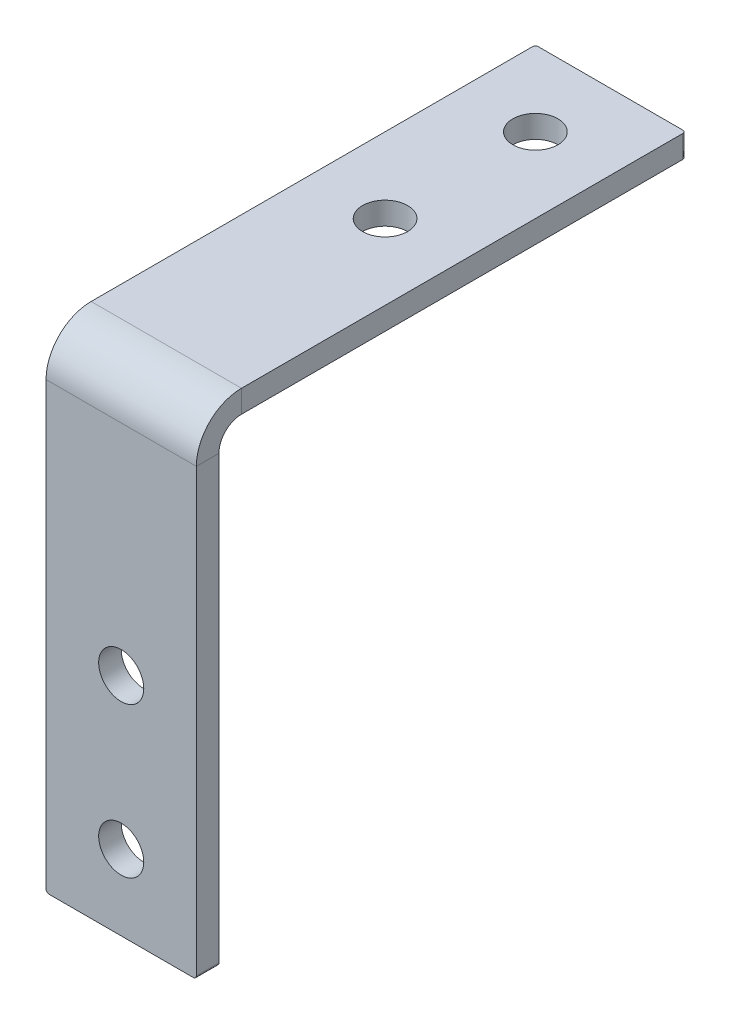
ISO-10303-21;
HEADER;
FILE_DESCRIPTION(('STEP AP214'),'2;1');
FILE_NAME('part.step','',(''),(''),'','','');
FILE_SCHEMA(('AUTOMOTIVE_DESIGN { 1 0 10303 214 1 1 1 1 }'));
ENDSEC;
DATA;
#1=APPLICATION_CONTEXT('core data for automotive mechanical design processes');
#2=APPLICATION_PROTOCOL_DEFINITION('international standard','automotive_design',2000,#1);
#3=PRODUCT_CONTEXT('',#1,'mechanical');
#4=PRODUCT('Part','Part','',(#3));
#5=PRODUCT_RELATED_PRODUCT_CATEGORY('part','',(#4));
#6=PRODUCT_DEFINITION_FORMATION('','',#4);
#7=PRODUCT_DEFINITION_CONTEXT('part definition',#1,'design');
#8=PRODUCT_DEFINITION('design','',#6,#7);
#9=PRODUCT_DEFINITION_SHAPE('','',#8);
#10=(LENGTH_UNIT() NAMED_UNIT(*) SI_UNIT(.MILLI.,.METRE.));
#11=(NAMED_UNIT(*) PLANE_ANGLE_UNIT() SI_UNIT($,.RADIAN.));
#12=(NAMED_UNIT(*) SI_UNIT($,.STERADIAN.) SOLID_ANGLE_UNIT());
#13=UNCERTAINTY_MEASURE_WITH_UNIT(LENGTH_MEASURE(1.E-05),#10,'distance_accuracy_value','');
#14=(GEOMETRIC_REPRESENTATION_CONTEXT(3) GLOBAL_UNCERTAINTY_ASSIGNED_CONTEXT((#13)) GLOBAL_UNIT_ASSIGNED_CONTEXT((#10,
#11,#12)) REPRESENTATION_CONTEXT('',''));
#15=CARTESIAN_POINT('',(0.,0.,0.));
#16=DIRECTION('',(0.,0.,1.));
#17=DIRECTION('',(1.,0.,0.));
#18=AXIS2_PLACEMENT_3D('',#15,#16,#17);
#19=CARTESIAN_POINT('',(10.,-1.69646003293849,3.375));
#20=DIRECTION('',(1.,0.,0.));
#21=DIRECTION('',(0.,1.,0.));
#22=AXIS2_PLACEMENT_3D('',#19,#20,#21);
#23=PLANE('',#22);
#24=CARTESIAN_POINT('',(10.,-1.69646003293849,-2.25));
#25=DIRECTION('',(1.,0.,0.));
#26=DIRECTION('',(0.,0.,1.));
#27=AXIS2_PLACEMENT_3D('',#24,#25,#26);
#28=CIRCLE('',#27,3.);
#29=CARTESIAN_POINT('',(10.,1.30353996706151,-2.25));
#30=VERTEX_POINT('',#29);
#31=CARTESIAN_POINT('',(10.,-1.69646003293849,0.75));
#32=VERTEX_POINT('',#31);
#33=EDGE_CURVE('E54',#30,#32,#28,.T.);
#34=ORIENTED_EDGE('',*,*,#33,.T.);
#35=DIRECTION('',(0.,0.,-1.));
#36=VECTOR('',#35,1.);
#37=CARTESIAN_POINT('',(10.,-1.69646003293849,0.75));
#38=LINE('',#37,#36);
#39=CARTESIAN_POINT('',(10.,-1.69646003293849,-0.75));
#40=VERTEX_POINT('',#39);
#41=EDGE_CURVE('E232',#32,#40,#38,.T.);
#42=ORIENTED_EDGE('',*,*,#41,.T.);
#43=CARTESIAN_POINT('',(10.,-1.69646003293849,-2.25));
#44=DIRECTION('',(-1.,0.,0.));
#45=DIRECTION('',(0.,0.,1.));
#46=AXIS2_PLACEMENT_3D('',#43,#44,#45);
#47=CIRCLE('',#46,1.5);
#48=CARTESIAN_POINT('',(10.,-0.196460032938488,-2.25));
#49=VERTEX_POINT('',#48);
#50=EDGE_CURVE('E273',#40,#49,#47,.T.);
#51=ORIENTED_EDGE('',*,*,#50,.T.);
#52=DIRECTION('',(0.,1.,0.));
#53=VECTOR('',#52,1.);
#54=CARTESIAN_POINT('',(10.,-0.196460032938488,-2.25));
#55=LINE('',#54,#53);
#56=EDGE_CURVE('E231',#49,#30,#55,.T.);
#57=ORIENTED_EDGE('',*,*,#56,.T.);
#58=EDGE_LOOP('',(#34,#42,#51,#57));
#59=FACE_BOUND('',#58,.T.);
#60=ADVANCED_FACE('F43',(#59),#23,.T.);
#61=CARTESIAN_POINT('',(0.,-1.69646003293849,3.375));
#62=DIRECTION('',(1.,0.,0.));
#63=DIRECTION('',(0.,1.,0.));
#64=AXIS2_PLACEMENT_3D('',#61,#62,#63);
#65=PLANE('',#64);
#66=CARTESIAN_POINT('',(0.,-1.69646003293849,-2.25));
#67=DIRECTION('',(-1.,0.,0.));
#68=DIRECTION('',(0.,0.,1.));
#69=AXIS2_PLACEMENT_3D('',#66,#67,#68);
#70=CIRCLE('',#69,3.);
#71=CARTESIAN_POINT('',(0.,-1.69646003293849,0.75));
#72=VERTEX_POINT('',#71);
#73=CARTESIAN_POINT('',(0.,1.30353996706151,-2.25));
#74=VERTEX_POINT('',#73);
#75=EDGE_CURVE('E11',#72,#74,#70,.T.);
#76=ORIENTED_EDGE('',*,*,#75,.T.);
#77=DIRECTION('',(0.,-1.,0.));
#78=VECTOR('',#77,1.);
#79=CARTESIAN_POINT('',(0.,1.30353996706151,-2.25));
#80=LINE('',#79,#78);
#81=CARTESIAN_POINT('',(0.,-0.196460032938488,-2.25));
#82=VERTEX_POINT('',#81);
#83=EDGE_CURVE('E221',#74,#82,#80,.T.);
#84=ORIENTED_EDGE('',*,*,#83,.T.);
#85=CARTESIAN_POINT('',(0.,-1.69646003293849,-2.25));
#86=DIRECTION('',(1.,0.,0.));
#87=DIRECTION('',(0.,0.,1.));
#88=AXIS2_PLACEMENT_3D('',#85,#86,#87);
#89=CIRCLE('',#88,1.5);
#90=CARTESIAN_POINT('',(0.,-1.69646003293849,-0.75));
#91=VERTEX_POINT('',#90);
#92=EDGE_CURVE('E277',#82,#91,#89,.T.);
#93=ORIENTED_EDGE('',*,*,#92,.T.);
#94=DIRECTION('',(0.,0.,1.));
#95=VECTOR('',#94,1.);
#96=CARTESIAN_POINT('',(0.,-1.69646003293849,-0.75));
#97=LINE('',#96,#95);
#98=EDGE_CURVE('E281',#91,#72,#97,.T.);
#99=ORIENTED_EDGE('',*,*,#98,.T.);
#100=EDGE_LOOP('',(#76,#84,#93,#99));
#101=FACE_BOUND('',#100,.T.);
#102=ADVANCED_FACE('F370',(#101),#65,.F.);
#103=CARTESIAN_POINT('',(5.,-1.69646003293849,-2.25));
#104=DIRECTION('',(1.,0.,0.));
#105=DIRECTION('',(0.,0.,1.));
#106=AXIS2_PLACEMENT_3D('',#103,#104,#105);
#107=CYLINDRICAL_SURFACE('',#106,3.);
#108=ORIENTED_EDGE('',*,*,#75,.F.);
#109=DIRECTION('',(1.,0.,0.));
#110=VECTOR('',#109,1.);
#111=CARTESIAN_POINT('',(0.,-1.69646003293849,0.75));
#112=LINE('',#111,#110);
#113=EDGE_CURVE('E247',#72,#32,#112,.T.);
#114=ORIENTED_EDGE('',*,*,#113,.T.);
#115=ORIENTED_EDGE('',*,*,#33,.F.);
#116=DIRECTION('',(-1.,0.,0.));
#117=VECTOR('',#116,1.);
#118=CARTESIAN_POINT('',(10.,1.30353996706151,-2.25));
#119=LINE('',#118,#117);
#120=EDGE_CURVE('E225',#30,#74,#119,.T.);
#121=ORIENTED_EDGE('',*,*,#120,.T.);
#122=EDGE_LOOP('',(#108,#114,#115,#121));
#123=FACE_BOUND('',#122,.T.);
#124=ADVANCED_FACE('F376',(#123),#107,.T.);
#125=CARTESIAN_POINT('',(5.,-1.69646003293849,-2.25));
#126=DIRECTION('',(1.,0.,0.));
#127=DIRECTION('',(0.,0.,1.));
#128=AXIS2_PLACEMENT_3D('',#125,#126,#127);
#129=CYLINDRICAL_SURFACE('',#128,1.5);
#130=ORIENTED_EDGE('',*,*,#92,.F.);
#131=DIRECTION('',(1.,0.,0.));
#132=VECTOR('',#131,1.);
#133=CARTESIAN_POINT('',(0.,-0.196460032938488,-2.25));
#134=LINE('',#133,#132);
#135=EDGE_CURVE('E311',#82,#49,#134,.T.);
#136=ORIENTED_EDGE('',*,*,#135,.T.);
#137=ORIENTED_EDGE('',*,*,#50,.F.);
#138=DIRECTION('',(-1.,0.,0.));
#139=VECTOR('',#138,1.);
#140=CARTESIAN_POINT('',(10.,-1.69646003293849,-0.75));
#141=LINE('',#140,#139);
#142=EDGE_CURVE('E278',#40,#91,#141,.T.);
#143=ORIENTED_EDGE('',*,*,#142,.T.);
#144=EDGE_LOOP('',(#130,#136,#137,#143));
#145=FACE_BOUND('',#144,.T.);
#146=ADVANCED_FACE('F544',(#145),#129,.F.);
#147=CARTESIAN_POINT('',(5.,15.3554568738932,-0.75));
#148=DIRECTION('',(0.,0.,-1.));
#149=DIRECTION('',(1.,0.,0.));
#150=AXIS2_PLACEMENT_3D('',#147,#148,#149);
#151=PLANE('',#150);
#152=ORIENTED_EDGE('',*,*,#142,.F.);
#153=DIRECTION('',(0.,1.,0.));
#154=VECTOR('',#153,1.);
#155=CARTESIAN_POINT('',(10.,-31.05,-0.75));
#156=LINE('',#155,#154);
#157=CARTESIAN_POINT('',(10.,-31.05,-0.75));
#158=VERTEX_POINT('',#157);
#159=EDGE_CURVE('E321',#158,#40,#156,.T.);
#160=ORIENTED_EDGE('',*,*,#159,.F.);
#161=CARTESIAN_POINT('',(9.8,-31.05,-0.75));
#162=DIRECTION('',(0.,0.,-1.));
#163=DIRECTION('',(0.707106781186551,-0.707106781186544,0.));
#164=AXIS2_PLACEMENT_3D('',#161,#162,#163);
#165=CIRCLE('',#164,0.2);
#166=CARTESIAN_POINT('',(9.8,-31.25,-0.75));
#167=VERTEX_POINT('',#166);
#168=EDGE_CURVE('E264',#158,#167,#165,.T.);
#169=ORIENTED_EDGE('',*,*,#168,.T.);
#170=DIRECTION('',(1.,0.,0.));
#171=VECTOR('',#170,1.);
#172=CARTESIAN_POINT('',(0.200000000000008,-31.25,-0.75));
#173=LINE('',#172,#171);
#174=CARTESIAN_POINT('',(0.200000000000009,-31.25,-0.75));
#175=VERTEX_POINT('',#174);
#176=EDGE_CURVE('E47',#175,#167,#173,.T.);
#177=ORIENTED_EDGE('',*,*,#176,.F.);
#178=CARTESIAN_POINT('',(0.20000000000001,-31.05,-0.75));
#179=DIRECTION('',(0.,0.,-1.));
#180=DIRECTION('',(-0.707106781186539,-0.707106781186556,0.));
#181=AXIS2_PLACEMENT_3D('',#178,#179,#180);
#182=CIRCLE('',#181,0.2);
#183=CARTESIAN_POINT('',(0.,-31.05,-0.75));
#184=VERTEX_POINT('',#183);
#185=EDGE_CURVE('E263',#175,#184,#182,.T.);
#186=ORIENTED_EDGE('',*,*,#185,.T.);
#187=DIRECTION('',(0.,1.,0.));
#188=VECTOR('',#187,1.);
#189=CARTESIAN_POINT('',(0.,-31.05,-0.75));
#190=LINE('',#189,#188);
#191=EDGE_CURVE('E268',#184,#91,#190,.T.);
#192=ORIENTED_EDGE('',*,*,#191,.T.);
#193=EDGE_LOOP('',(#152,#160,#169,#177,#186,#192));
#194=FACE_BOUND('',#193,.T.);
#195=CARTESIAN_POINT('',(5.,-26.25,-0.75));
#196=DIRECTION('',(0.,0.,1.));
#197=DIRECTION('',(-1.,0.,0.));
#198=AXIS2_PLACEMENT_3D('',#195,#196,#197);
#199=CIRCLE('',#198,1.5);
#200=CARTESIAN_POINT('',(6.5,-26.25,-0.75));
#201=VERTEX_POINT('',#200);
#202=EDGE_CURVE('E255',#201,#201,#199,.T.);
#203=ORIENTED_EDGE('',*,*,#202,.T.);
#204=EDGE_LOOP('',(#203));
#205=FACE_BOUND('',#204,.T.);
#206=CARTESIAN_POINT('',(5.,-16.25,-0.75));
#207=DIRECTION('',(0.,0.,1.));
#208=DIRECTION('',(-1.,0.,0.));
#209=AXIS2_PLACEMENT_3D('',#206,#207,#208);
#210=CIRCLE('',#209,1.5);
#211=CARTESIAN_POINT('',(6.5,-16.25,-0.75));
#212=VERTEX_POINT('',#211);
#213=EDGE_CURVE('E256',#212,#212,#210,.T.);
#214=ORIENTED_EDGE('',*,*,#213,.T.);
#215=EDGE_LOOP('',(#214));
#216=FACE_BOUND('',#215,.T.);
#217=ADVANCED_FACE('F347',(#194,#205,#216),#151,.T.);
#218=CARTESIAN_POINT('',(0.,0.,0.));
#219=DIRECTION('',(-1.,0.,0.));
#220=DIRECTION('',(0.,0.,-1.));
#221=AXIS2_PLACEMENT_3D('',#218,#219,#220);
#222=PLANE('',#221);
#223=ORIENTED_EDGE('',*,*,#98,.F.);
#224=ORIENTED_EDGE('',*,*,#191,.F.);
#225=DIRECTION('',(0.,0.,1.));
#226=VECTOR('',#225,1.);
#227=CARTESIAN_POINT('',(0.,-31.05,-0.75));
#228=LINE('',#227,#226);
#229=CARTESIAN_POINT('',(0.,-31.05,0.75));
#230=VERTEX_POINT('',#229);
#231=EDGE_CURVE('E292',#184,#230,#228,.T.);
#232=ORIENTED_EDGE('',*,*,#231,.T.);
#233=DIRECTION('',(0.,1.,0.));
#234=VECTOR('',#233,1.);
#235=CARTESIAN_POINT('',(0.,-31.05,0.75));
#236=LINE('',#235,#234);
#237=EDGE_CURVE('E236',#230,#72,#236,.T.);
#238=ORIENTED_EDGE('',*,*,#237,.T.);
#239=EDGE_LOOP('',(#223,#224,#232,#238));
#240=FACE_BOUND('',#239,.T.);
#241=ADVANCED_FACE('F408',(#240),#222,.T.);
#242=CARTESIAN_POINT('',(9.8,-31.05,0.));
#243=DIRECTION('',(0.,0.,-1.));
#244=DIRECTION('',(0.707106781186551,-0.707106781186544,0.));
#245=AXIS2_PLACEMENT_3D('',#242,#243,#244);
#246=CYLINDRICAL_SURFACE('',#245,0.2);
#247=ORIENTED_EDGE('',*,*,#168,.F.);
#248=DIRECTION('',(0.,0.,-1.));
#249=VECTOR('',#248,1.);
#250=CARTESIAN_POINT('',(10.,-31.05,0.75));
#251=LINE('',#250,#249);
#252=CARTESIAN_POINT('',(10.,-31.05,0.75));
#253=VERTEX_POINT('',#252);
#254=EDGE_CURVE('E259',#253,#158,#251,.T.);
#255=ORIENTED_EDGE('',*,*,#254,.F.);
#256=CARTESIAN_POINT('',(9.8,-31.05,0.75));
#257=DIRECTION('',(0.,0.,1.));
#258=DIRECTION('',(0.707106781186551,-0.707106781186544,0.));
#259=AXIS2_PLACEMENT_3D('',#256,#257,#258);
#260=CIRCLE('',#259,0.2);
#261=CARTESIAN_POINT('',(9.8,-31.25,0.75));
#262=VERTEX_POINT('',#261);
#263=EDGE_CURVE('E262',#262,#253,#260,.T.);
#264=ORIENTED_EDGE('',*,*,#263,.F.);
#265=DIRECTION('',(0.,0.,1.));
#266=VECTOR('',#265,1.);
#267=CARTESIAN_POINT('',(9.8,-31.25,-0.75));
#268=LINE('',#267,#266);
#269=EDGE_CURVE('E269',#167,#262,#268,.T.);
#270=ORIENTED_EDGE('',*,*,#269,.F.);
#271=EDGE_LOOP('',(#247,#255,#264,#270));
#272=FACE_BOUND('',#271,.T.);
#273=ADVANCED_FACE('F398',(#272),#246,.T.);
#274=CARTESIAN_POINT('',(9.8,-31.25,0.75));
#275=CARTESIAN_POINT('',(0.200000000000008,-31.25,0.75));
#276=CARTESIAN_POINT('',(9.8,-31.25,-0.75));
#277=CARTESIAN_POINT('',(0.200000000000008,-31.25,-0.75));
#278=(BOUNDED_SURFACE() B_SPLINE_SURFACE(1,1,((#274,#275),(#276,#277)),.UNSPECIFIED.,.F.,.F.,
.F.) B_SPLINE_SURFACE_WITH_KNOTS((2,2),(2,2),(0.,1.5),(0.,9.6),
.UNSPECIFIED.) GEOMETRIC_REPRESENTATION_ITEM() RATIONAL_B_SPLINE_SURFACE(((1.,1.),(1.,1.))) REPRESENTATION_ITEM('') SURFACE());
#279=DIRECTION('',(-1.,0.,0.));
#280=VECTOR('',#279,1.);
#281=CARTESIAN_POINT('',(9.8,-31.25,0.75));
#282=LINE('',#281,#280);
#283=CARTESIAN_POINT('',(0.200000000000009,-31.25,0.75));
#284=VERTEX_POINT('',#283);
#285=EDGE_CURVE('E243',#262,#284,#282,.T.);
#286=DIRECTION('',(0.,0.,-1.));
#287=VECTOR('',#286,1.);
#288=CARTESIAN_POINT('',(0.20000000000001,-31.25,0.75));
#289=LINE('',#288,#287);
#290=EDGE_CURVE('E304',#284,#175,#289,.T.);
#291=ORIENTED_EDGE('',*,*,#269,.T.);
#292=ORIENTED_EDGE('',*,*,#285,.T.);
#293=ORIENTED_EDGE('',*,*,#290,.T.);
#294=ORIENTED_EDGE('',*,*,#176,.T.);
#295=EDGE_LOOP('',(#291,#292,#293,#294));
#296=FACE_BOUND('',#295,.T.);
#297=ADVANCED_FACE('F389',(#296),#278,.F.);
#298=CARTESIAN_POINT('',(0.20000000000001,-31.05,0.));
#299=DIRECTION('',(0.,0.,-1.));
#300=DIRECTION('',(-0.707106781186539,-0.707106781186556,0.));
#301=AXIS2_PLACEMENT_3D('',#298,#299,#300);
#302=CYLINDRICAL_SURFACE('',#301,0.2);
#303=ORIENTED_EDGE('',*,*,#185,.F.);
#304=ORIENTED_EDGE('',*,*,#290,.F.);
#305=CARTESIAN_POINT('',(0.20000000000001,-31.05,0.75));
#306=DIRECTION('',(0.,0.,1.));
#307=DIRECTION('',(-0.707106781186539,-0.707106781186556,0.));
#308=AXIS2_PLACEMENT_3D('',#305,#306,#307);
#309=CIRCLE('',#308,0.2);
#310=EDGE_CURVE('E337',#230,#284,#309,.T.);
#311=ORIENTED_EDGE('',*,*,#310,.F.);
#312=ORIENTED_EDGE('',*,*,#231,.F.);
#313=EDGE_LOOP('',(#303,#304,#311,#312));
#314=FACE_BOUND('',#313,.T.);
#315=ADVANCED_FACE('F362',(#314),#302,.T.);
#316=CARTESIAN_POINT('',(6.5,-26.25,0.75));
#317=CARTESIAN_POINT('',(6.5,-27.75,0.75));
#318=CARTESIAN_POINT('',(5.,-27.75,0.75));
#319=CARTESIAN_POINT('',(3.49999999999999,-27.75,0.75));
#320=CARTESIAN_POINT('',(3.5,-26.25,0.75));
#321=CARTESIAN_POINT('',(3.49999999999999,-24.75,0.75));
#322=CARTESIAN_POINT('',(5.,-24.75,0.75));
#323=CARTESIAN_POINT('',(6.5,-24.75,0.75));
#324=CARTESIAN_POINT('',(6.5,-26.25,0.75));
#325=CARTESIAN_POINT('',(6.5,-26.25,-0.75));
#326=CARTESIAN_POINT('',(6.5,-27.75,-0.75));
#327=CARTESIAN_POINT('',(5.,-27.75,-0.75));
#328=CARTESIAN_POINT('',(3.49999999999999,-27.75,-0.75));
#329=CARTESIAN_POINT('',(3.5,-26.25,-0.75));
#330=CARTESIAN_POINT('',(3.49999999999999,-24.75,-0.75));
#331=CARTESIAN_POINT('',(5.,-24.75,-0.75));
#332=CARTESIAN_POINT('',(6.5,-24.75,-0.75));
#333=CARTESIAN_POINT('',(6.5,-26.25,-0.75));
#334=(BOUNDED_SURFACE() B_SPLINE_SURFACE(1,2,((#316,#317,#318,#319,#320,#321,#322,#323,#324),
(#325,#326,#327,#328,#329,#330,#331,#332,#333)),.UNSPECIFIED.,.F.,.T.,
.F.) B_SPLINE_SURFACE_WITH_KNOTS((2,2),(3,2,2,2,3),(-0.5,0.5),(0.,2.35619449019234,
4.71238898038469,7.06858347057704,9.42477796076938),
.UNSPECIFIED.) GEOMETRIC_REPRESENTATION_ITEM() RATIONAL_B_SPLINE_SURFACE(((1.,0.707106781186548,
1.,0.707106781186548,1.,0.707106781186548,1.,0.707106781186548,1.),(1.,0.707106781186548,1.,
0.707106781186548,1.,0.707106781186548,1.,0.707106781186548,1.))) REPRESENTATION_ITEM('') SURFACE());
#335=CARTESIAN_POINT('',(5.,-26.25,0.75));
#336=DIRECTION('',(0.,0.,-1.));
#337=DIRECTION('',(-1.,0.,0.));
#338=AXIS2_PLACEMENT_3D('',#335,#336,#337);
#339=CIRCLE('',#338,1.5);
#340=CARTESIAN_POINT('',(6.5,-26.25,0.75));
#341=VERTEX_POINT('',#340);
#342=EDGE_CURVE('E301',#341,#341,#339,.T.);
#343=ORIENTED_EDGE('',*,*,#342,.F.);
#344=EDGE_LOOP('',(#343));
#345=FACE_BOUND('',#344,.T.);
#346=ORIENTED_EDGE('',*,*,#202,.F.);
#347=EDGE_LOOP('',(#346));
#348=FACE_BOUND('',#347,.T.);
#349=ADVANCED_FACE('F352',(#345,#348),#334,.T.);
#350=CARTESIAN_POINT('',(6.5,-16.25,0.75));
#351=CARTESIAN_POINT('',(6.5,-17.75,0.75));
#352=CARTESIAN_POINT('',(5.,-17.75,0.75));
#353=CARTESIAN_POINT('',(3.49999999999999,-17.75,0.75));
#354=CARTESIAN_POINT('',(3.5,-16.25,0.75));
#355=CARTESIAN_POINT('',(3.49999999999999,-14.75,0.75));
#356=CARTESIAN_POINT('',(5.,-14.75,0.75));
#357=CARTESIAN_POINT('',(6.5,-14.75,0.75));
#358=CARTESIAN_POINT('',(6.5,-16.25,0.75));
#359=CARTESIAN_POINT('',(6.5,-16.25,-0.75));
#360=CARTESIAN_POINT('',(6.5,-17.75,-0.75));
#361=CARTESIAN_POINT('',(5.,-17.75,-0.75));
#362=CARTESIAN_POINT('',(3.49999999999999,-17.75,-0.75));
#363=CARTESIAN_POINT('',(3.5,-16.25,-0.75));
#364=CARTESIAN_POINT('',(3.49999999999999,-14.75,-0.75));
#365=CARTESIAN_POINT('',(5.,-14.75,-0.75));
#366=CARTESIAN_POINT('',(6.5,-14.75,-0.75));
#367=CARTESIAN_POINT('',(6.5,-16.25,-0.75));
#368=(BOUNDED_SURFACE() B_SPLINE_SURFACE(1,2,((#350,#351,#352,#353,#354,#355,#356,#357,#358),
(#359,#360,#361,#362,#363,#364,#365,#366,#367)),.UNSPECIFIED.,.F.,.T.,
.F.) B_SPLINE_SURFACE_WITH_KNOTS((2,2),(3,2,2,2,3),(-0.5,0.5),(0.,2.35619449019234,
4.71238898038469,7.06858347057704,9.42477796076938),
.UNSPECIFIED.) GEOMETRIC_REPRESENTATION_ITEM() RATIONAL_B_SPLINE_SURFACE(((1.,0.707106781186548,
1.,0.707106781186548,1.,0.707106781186548,1.,0.707106781186548,1.),(1.,0.707106781186548,1.,
0.707106781186548,1.,0.707106781186548,1.,0.707106781186548,1.))) REPRESENTATION_ITEM('') SURFACE());
#369=CARTESIAN_POINT('',(5.,-16.25,0.75));
#370=DIRECTION('',(0.,0.,-1.));
#371=DIRECTION('',(-1.,0.,0.));
#372=AXIS2_PLACEMENT_3D('',#369,#370,#371);
#373=CIRCLE('',#372,1.5);
#374=CARTESIAN_POINT('',(6.5,-16.25,0.75));
#375=VERTEX_POINT('',#374);
#376=EDGE_CURVE('E252',#375,#375,#373,.T.);
#377=ORIENTED_EDGE('',*,*,#376,.F.);
#378=EDGE_LOOP('',(#377));
#379=FACE_BOUND('',#378,.T.);
#380=ORIENTED_EDGE('',*,*,#213,.F.);
#381=EDGE_LOOP('',(#380));
#382=FACE_BOUND('',#381,.T.);
#383=ADVANCED_FACE('F349',(#379,#382),#368,.T.);
#384=CARTESIAN_POINT('',(5.,15.3554568738932,0.75));
#385=DIRECTION('',(0.,0.,-1.));
#386=DIRECTION('',(1.,0.,0.));
#387=AXIS2_PLACEMENT_3D('',#384,#385,#386);
#388=PLANE('',#387);
#389=ORIENTED_EDGE('',*,*,#113,.F.);
#390=ORIENTED_EDGE('',*,*,#237,.F.);
#391=ORIENTED_EDGE('',*,*,#310,.T.);
#392=ORIENTED_EDGE('',*,*,#285,.F.);
#393=ORIENTED_EDGE('',*,*,#263,.T.);
#394=DIRECTION('',(0.,1.,0.));
#395=VECTOR('',#394,1.);
#396=CARTESIAN_POINT('',(10.,-31.05,0.75));
#397=LINE('',#396,#395);
#398=EDGE_CURVE('E237',#253,#32,#397,.T.);
#399=ORIENTED_EDGE('',*,*,#398,.T.);
#400=EDGE_LOOP('',(#389,#390,#391,#392,#393,#399));
#401=FACE_BOUND('',#400,.T.);
#402=ORIENTED_EDGE('',*,*,#376,.T.);
#403=EDGE_LOOP('',(#402));
#404=FACE_BOUND('',#403,.T.);
#405=ORIENTED_EDGE('',*,*,#342,.T.);
#406=EDGE_LOOP('',(#405));
#407=FACE_BOUND('',#406,.T.);
#408=ADVANCED_FACE('F351',(#401,#404,#407),#388,.F.);
#409=CARTESIAN_POINT('',(10.,31.25,0.));
#410=DIRECTION('',(1.,0.,0.));
#411=DIRECTION('',(0.,1.,0.));
#412=AXIS2_PLACEMENT_3D('',#409,#410,#411);
#413=PLANE('',#412);
#414=ORIENTED_EDGE('',*,*,#41,.F.);
#415=ORIENTED_EDGE('',*,*,#398,.F.);
#416=ORIENTED_EDGE('',*,*,#254,.T.);
#417=ORIENTED_EDGE('',*,*,#159,.T.);
#418=EDGE_LOOP('',(#414,#415,#416,#417));
#419=FACE_BOUND('',#418,.T.);
#420=ADVANCED_FACE('F359',(#419),#413,.T.);
#421=CARTESIAN_POINT('',(5.,0.553539967061515,-16.8035399670615));
#422=DIRECTION('',(0.,-1.,0.));
#423=DIRECTION('',(-1.,0.,0.));
#424=AXIS2_PLACEMENT_3D('',#421,#422,#423);
#425=CYLINDRICAL_SURFACE('',#424,1.5);
#426=CARTESIAN_POINT('',(5.,1.30353996706151,-16.8035399670615));
#427=DIRECTION('',(0.,1.,0.));
#428=DIRECTION('',(-1.,0.,0.));
#429=AXIS2_PLACEMENT_3D('',#426,#427,#428);
#430=CIRCLE('',#429,1.5);
#431=CARTESIAN_POINT('',(6.5,1.30353996706151,-16.8035399670615));
#432=VERTEX_POINT('',#431);
#433=EDGE_CURVE('E227',#432,#432,#430,.T.);
#434=ORIENTED_EDGE('',*,*,#433,.T.);
#435=EDGE_LOOP('',(#434));
#436=FACE_BOUND('',#435,.T.);
#437=CARTESIAN_POINT('',(5.,-0.196460032938485,-16.8035399670615));
#438=DIRECTION('',(0.,-1.,0.));
#439=DIRECTION('',(-1.,0.,0.));
#440=AXIS2_PLACEMENT_3D('',#437,#438,#439);
#441=CIRCLE('',#440,1.5);
#442=CARTESIAN_POINT('',(6.5,-0.196460032938485,-16.8035399670615));
#443=VERTEX_POINT('',#442);
#444=EDGE_CURVE('E248',#443,#443,#441,.T.);
#445=ORIENTED_EDGE('',*,*,#444,.T.);
#446=EDGE_LOOP('',(#445));
#447=FACE_BOUND('',#446,.T.);
#448=ADVANCED_FACE('F45',(#436,#447),#425,.F.);
#449=CARTESIAN_POINT('',(5.,0.553539967061517,-26.8035399670615));
#450=DIRECTION('',(0.,-1.,0.));
#451=DIRECTION('',(-1.,0.,0.));
#452=AXIS2_PLACEMENT_3D('',#449,#450,#451);
#453=CYLINDRICAL_SURFACE('',#452,1.5);
#454=CARTESIAN_POINT('',(5.,1.30353996706152,-26.8035399670615));
#455=DIRECTION('',(0.,1.,0.));
#456=DIRECTION('',(-1.,0.,0.));
#457=AXIS2_PLACEMENT_3D('',#454,#455,#456);
#458=CIRCLE('',#457,1.5);
#459=CARTESIAN_POINT('',(6.5,1.30353996706152,-26.8035399670615));
#460=VERTEX_POINT('',#459);
#461=EDGE_CURVE('E230',#460,#460,#458,.T.);
#462=ORIENTED_EDGE('',*,*,#461,.T.);
#463=EDGE_LOOP('',(#462));
#464=FACE_BOUND('',#463,.T.);
#465=CARTESIAN_POINT('',(5.,-0.196460032938483,-26.8035399670615));
#466=DIRECTION('',(0.,-1.,0.));
#467=DIRECTION('',(-1.,0.,0.));
#468=AXIS2_PLACEMENT_3D('',#465,#466,#467);
#469=CIRCLE('',#468,1.5);
#470=CARTESIAN_POINT('',(6.5,-0.196460032938483,-26.8035399670615));
#471=VERTEX_POINT('',#470);
#472=EDGE_CURVE('E251',#471,#471,#469,.T.);
#473=ORIENTED_EDGE('',*,*,#472,.T.);
#474=EDGE_LOOP('',(#473));
#475=FACE_BOUND('',#474,.T.);
#476=ADVANCED_FACE('F420',(#464,#475),#453,.F.);
#477=CARTESIAN_POINT('',(0.,0.553539967061511,-0.553539967061511));
#478=DIRECTION('',(-1.,0.,0.));
#479=DIRECTION('',(0.,0.,-1.));
#480=AXIS2_PLACEMENT_3D('',#477,#478,#479);
#481=PLANE('',#480);
#482=ORIENTED_EDGE('',*,*,#83,.F.);
#483=DIRECTION('',(0.,0.,-1.));
#484=VECTOR('',#483,1.);
#485=CARTESIAN_POINT('',(0.,1.30353996706151,-2.25));
#486=LINE('',#485,#484);
#487=CARTESIAN_POINT('',(0.,1.30353996706152,-31.6035399670615));
#488=VERTEX_POINT('',#487);
#489=EDGE_CURVE('E298',#74,#488,#486,.T.);
#490=ORIENTED_EDGE('',*,*,#489,.T.);
#491=DIRECTION('',(0.,-1.,0.));
#492=VECTOR('',#491,1.);
#493=CARTESIAN_POINT('',(0.,1.30353996706152,-31.6035399670615));
#494=LINE('',#493,#492);
#495=CARTESIAN_POINT('',(0.,-0.196460032938482,-31.6035399670615));
#496=VERTEX_POINT('',#495);
#497=EDGE_CURVE('E239',#488,#496,#494,.T.);
#498=ORIENTED_EDGE('',*,*,#497,.T.);
#499=DIRECTION('',(0.,0.,-1.));
#500=VECTOR('',#499,1.);
#501=CARTESIAN_POINT('',(0.,-0.196460032938488,-2.25));
#502=LINE('',#501,#500);
#503=EDGE_CURVE('E214',#82,#496,#502,.T.);
#504=ORIENTED_EDGE('',*,*,#503,.F.);
#505=EDGE_LOOP('',(#482,#490,#498,#504));
#506=FACE_BOUND('',#505,.T.);
#507=ADVANCED_FACE('F413',(#506),#481,.T.);
#508=CARTESIAN_POINT('',(0.199999999999991,0.553539967061518,-31.6035399670615));
#509=DIRECTION('',(0.,-1.,0.));
#510=DIRECTION('',(-0.707106781186539,0.,-0.707106781186556));
#511=AXIS2_PLACEMENT_3D('',#508,#509,#510);
#512=CYLINDRICAL_SURFACE('',#511,0.2);
#513=CARTESIAN_POINT('',(0.199999999999991,-0.196460032938482,-31.6035399670615));
#514=DIRECTION('',(0.,-1.,0.));
#515=DIRECTION('',(-0.707106781186539,0.,-0.707106781186556));
#516=AXIS2_PLACEMENT_3D('',#513,#514,#515);
#517=CIRCLE('',#516,0.2);
#518=CARTESIAN_POINT('',(0.19999999999999,-0.196460032938482,-31.8035399670615));
#519=VERTEX_POINT('',#518);
#520=EDGE_CURVE('E205',#496,#519,#517,.T.);
#521=ORIENTED_EDGE('',*,*,#520,.F.);
#522=ORIENTED_EDGE('',*,*,#497,.F.);
#523=CARTESIAN_POINT('',(0.199999999999991,1.30353996706152,-31.6035399670615));
#524=DIRECTION('',(0.,1.,0.));
#525=DIRECTION('',(-0.707106781186539,0.,-0.707106781186556));
#526=AXIS2_PLACEMENT_3D('',#523,#524,#525);
#527=CIRCLE('',#526,0.2);
#528=CARTESIAN_POINT('',(0.19999999999999,1.30353996706152,-31.8035399670615));
#529=VERTEX_POINT('',#528);
#530=EDGE_CURVE('E207',#529,#488,#527,.T.);
#531=ORIENTED_EDGE('',*,*,#530,.F.);
#532=DIRECTION('',(0.,1.,0.));
#533=VECTOR('',#532,1.);
#534=CARTESIAN_POINT('',(0.199999999999991,-0.196460032938482,-31.8035399670615));
#535=LINE('',#534,#533);
#536=EDGE_CURVE('E191',#519,#529,#535,.T.);
#537=ORIENTED_EDGE('',*,*,#536,.F.);
#538=EDGE_LOOP('',(#521,#522,#531,#537));
#539=FACE_BOUND('',#538,.T.);
#540=ADVANCED_FACE('F203',(#539),#512,.T.);
#541=CARTESIAN_POINT('',(0.,0.553539967061518,-31.8035399670615));
#542=DIRECTION('',(0.,0.,-1.));
#543=DIRECTION('',(1.,0.,0.));
#544=AXIS2_PLACEMENT_3D('',#541,#542,#543);
#545=PLANE('',#544);
#546=DIRECTION('',(0.,-1.,0.));
#547=VECTOR('',#546,1.);
#548=CARTESIAN_POINT('',(9.8,1.30353996706152,-31.8035399670615));
#549=LINE('',#548,#547);
#550=CARTESIAN_POINT('',(9.8,1.30353996706152,-31.8035399670615));
#551=VERTEX_POINT('',#550);
#552=CARTESIAN_POINT('',(9.8,-0.196460032938482,-31.8035399670615));
#553=VERTEX_POINT('',#552);
#554=EDGE_CURVE('E194',#551,#553,#549,.T.);
#555=ORIENTED_EDGE('',*,*,#554,.T.);
#556=DIRECTION('',(1.,0.,0.));
#557=VECTOR('',#556,1.);
#558=CARTESIAN_POINT('',(0.199999999999989,-0.196460032938482,-31.8035399670615));
#559=LINE('',#558,#557);
#560=EDGE_CURVE('E187',#519,#553,#559,.T.);
#561=ORIENTED_EDGE('',*,*,#560,.F.);
#562=ORIENTED_EDGE('',*,*,#536,.T.);
#563=DIRECTION('',(-1.,0.,0.));
#564=VECTOR('',#563,1.);
#565=CARTESIAN_POINT('',(9.8,1.30353996706152,-31.8035399670615));
#566=LINE('',#565,#564);
#567=EDGE_CURVE('E199',#551,#529,#566,.T.);
#568=ORIENTED_EDGE('',*,*,#567,.F.);
#569=EDGE_LOOP('',(#555,#561,#562,#568));
#570=FACE_BOUND('',#569,.T.);
#571=ADVANCED_FACE('F189',(#570),#545,.T.);
#572=CARTESIAN_POINT('',(9.8,0.553539967061518,-31.6035399670615));
#573=DIRECTION('',(0.,-1.,0.));
#574=DIRECTION('',(0.70710678118654,0.,-0.707106781186555));
#575=AXIS2_PLACEMENT_3D('',#572,#573,#574);
#576=CYLINDRICAL_SURFACE('',#575,0.2);
#577=CARTESIAN_POINT('',(9.8,-0.196460032938482,-31.6035399670615));
#578=DIRECTION('',(0.,-1.,0.));
#579=DIRECTION('',(0.70710678118654,0.,-0.707106781186555));
#580=AXIS2_PLACEMENT_3D('',#577,#578,#579);
#581=CIRCLE('',#580,0.2);
#582=CARTESIAN_POINT('',(10.,-0.196460032938482,-31.6035399670615));
#583=VERTEX_POINT('',#582);
#584=EDGE_CURVE('E200',#553,#583,#581,.T.);
#585=ORIENTED_EDGE('',*,*,#584,.F.);
#586=ORIENTED_EDGE('',*,*,#554,.F.);
#587=CARTESIAN_POINT('',(9.8,1.30353996706152,-31.6035399670615));
#588=DIRECTION('',(0.,1.,0.));
#589=DIRECTION('',(0.70710678118654,0.,-0.707106781186555));
#590=AXIS2_PLACEMENT_3D('',#587,#588,#589);
#591=CIRCLE('',#590,0.2);
#592=CARTESIAN_POINT('',(10.,1.30353996706152,-31.6035399670615));
#593=VERTEX_POINT('',#592);
#594=EDGE_CURVE('E305',#593,#551,#591,.T.);
#595=ORIENTED_EDGE('',*,*,#594,.F.);
#596=DIRECTION('',(0.,1.,0.));
#597=VECTOR('',#596,1.);
#598=CARTESIAN_POINT('',(10.,-0.196460032938482,-31.6035399670615));
#599=LINE('',#598,#597);
#600=EDGE_CURVE('E288',#583,#593,#599,.T.);
#601=ORIENTED_EDGE('',*,*,#600,.F.);
#602=EDGE_LOOP('',(#585,#586,#595,#601));
#603=FACE_BOUND('',#602,.T.);
#604=ADVANCED_FACE('F386',(#603),#576,.T.);
#605=CARTESIAN_POINT('',(5.,1.30353996706151,-15.9089968409547));
#606=DIRECTION('',(0.,-1.,0.));
#607=DIRECTION('',(0.,0.,1.));
#608=AXIS2_PLACEMENT_3D('',#605,#606,#607);
#609=PLANE('',#608);
#610=ORIENTED_EDGE('',*,*,#120,.F.);
#611=DIRECTION('',(0.,0.,-1.));
#612=VECTOR('',#611,1.);
#613=CARTESIAN_POINT('',(10.,1.30353996706151,-2.25));
#614=LINE('',#613,#612);
#615=EDGE_CURVE('E67',#30,#593,#614,.T.);
#616=ORIENTED_EDGE('',*,*,#615,.T.);
#617=ORIENTED_EDGE('',*,*,#594,.T.);
#618=ORIENTED_EDGE('',*,*,#567,.T.);
#619=ORIENTED_EDGE('',*,*,#530,.T.);
#620=ORIENTED_EDGE('',*,*,#489,.F.);
#621=EDGE_LOOP('',(#610,#616,#617,#618,#619,#620));
#622=FACE_BOUND('',#621,.T.);
#623=ORIENTED_EDGE('',*,*,#461,.F.);
#624=EDGE_LOOP('',(#623));
#625=FACE_BOUND('',#624,.T.);
#626=ORIENTED_EDGE('',*,*,#433,.F.);
#627=EDGE_LOOP('',(#626));
#628=FACE_BOUND('',#627,.T.);
#629=ADVANCED_FACE('F382',(#622,#625,#628),#609,.F.);
#630=CARTESIAN_POINT('',(10.,0.553539967061518,-31.8035399670615));
#631=DIRECTION('',(1.,0.,0.));
#632=DIRECTION('',(0.,1.,0.));
#633=AXIS2_PLACEMENT_3D('',#630,#631,#632);
#634=PLANE('',#633);
#635=ORIENTED_EDGE('',*,*,#56,.F.);
#636=DIRECTION('',(0.,0.,-1.));
#637=VECTOR('',#636,1.);
#638=CARTESIAN_POINT('',(10.,-0.196460032938488,-2.25));
#639=LINE('',#638,#637);
#640=EDGE_CURVE('E308',#49,#583,#639,.T.);
#641=ORIENTED_EDGE('',*,*,#640,.T.);
#642=ORIENTED_EDGE('',*,*,#600,.T.);
#643=ORIENTED_EDGE('',*,*,#615,.F.);
#644=EDGE_LOOP('',(#635,#641,#642,#643));
#645=FACE_BOUND('',#644,.T.);
#646=ADVANCED_FACE('F393',(#645),#634,.T.);
#647=CARTESIAN_POINT('',(5.,-0.196460032938485,-15.9089968409547));
#648=DIRECTION('',(0.,-1.,0.));
#649=DIRECTION('',(0.,0.,1.));
#650=AXIS2_PLACEMENT_3D('',#647,#648,#649);
#651=PLANE('',#650);
#652=ORIENTED_EDGE('',*,*,#135,.F.);
#653=ORIENTED_EDGE('',*,*,#503,.T.);
#654=ORIENTED_EDGE('',*,*,#520,.T.);
#655=ORIENTED_EDGE('',*,*,#560,.T.);
#656=ORIENTED_EDGE('',*,*,#584,.T.);
#657=ORIENTED_EDGE('',*,*,#640,.F.);
#658=EDGE_LOOP('',(#652,#653,#654,#655,#656,#657));
#659=FACE_BOUND('',#658,.T.);
#660=ORIENTED_EDGE('',*,*,#472,.F.);
#661=EDGE_LOOP('',(#660));
#662=FACE_BOUND('',#661,.T.);
#663=ORIENTED_EDGE('',*,*,#444,.F.);
#664=EDGE_LOOP('',(#663));
#665=FACE_BOUND('',#664,.T.);
#666=ADVANCED_FACE('F211',(#659,#662,#665),#651,.T.);
#667=CLOSED_SHELL('',(#60,#102,#124,#146,#217,#241,#273,#297,#315,#349,#383,#408,#420,#448,#476,
#507,#540,#571,#604,#629,#646,#666));
#668=MANIFOLD_SOLID_BREP('B2',#667);
#669=ADVANCED_BREP_SHAPE_REPRESENTATION('',(#18,#668),#14);
#670=SHAPE_DEFINITION_REPRESENTATION(#9,#669);
ENDSEC;
END-ISO-10303-21;
